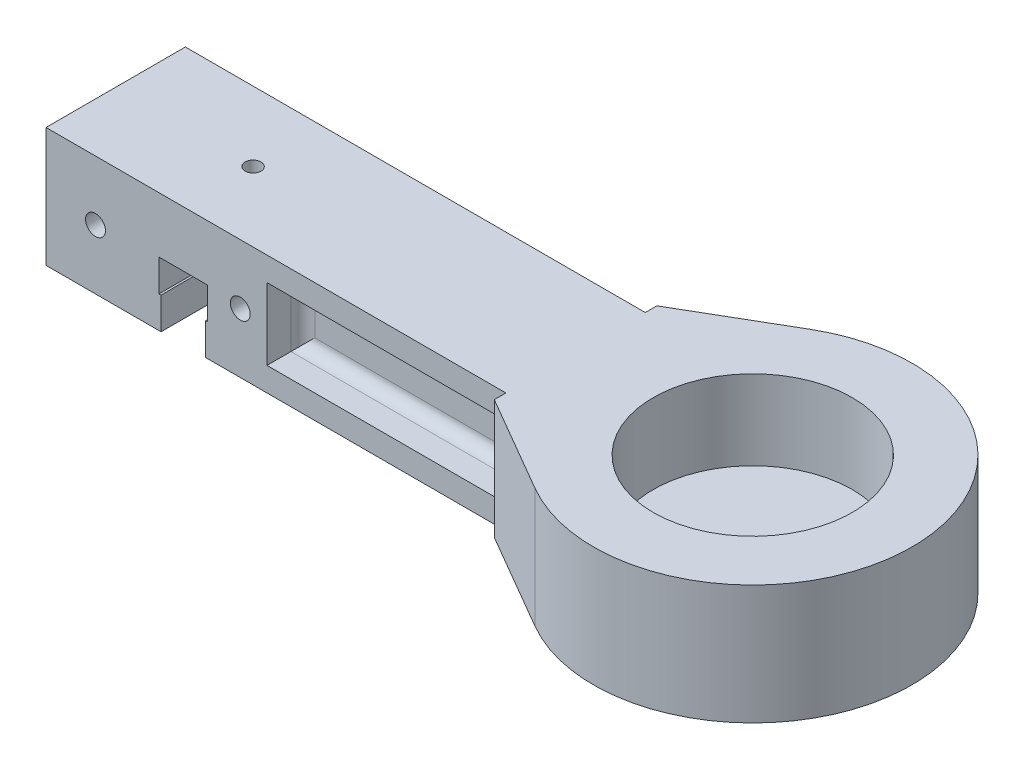
ISO-10303-21;
HEADER;
FILE_DESCRIPTION(('STEP AP214'),'2;1');
FILE_NAME('part.step','',(''),(''),'','','');
FILE_SCHEMA(('AUTOMOTIVE_DESIGN { 1 0 10303 214 1 1 1 1 }'));
ENDSEC;
DATA;
#1=APPLICATION_CONTEXT('core data for automotive mechanical design processes');
#2=APPLICATION_PROTOCOL_DEFINITION('international standard','automotive_design',2000,#1);
#3=PRODUCT_CONTEXT('',#1,'mechanical');
#4=PRODUCT('Part','Part','',(#3));
#5=PRODUCT_RELATED_PRODUCT_CATEGORY('part','',(#4));
#6=PRODUCT_DEFINITION_FORMATION('','',#4);
#7=PRODUCT_DEFINITION_CONTEXT('part definition',#1,'design');
#8=PRODUCT_DEFINITION('design','',#6,#7);
#9=PRODUCT_DEFINITION_SHAPE('','',#8);
#10=(LENGTH_UNIT() NAMED_UNIT(*) SI_UNIT(.MILLI.,.METRE.));
#11=(NAMED_UNIT(*) PLANE_ANGLE_UNIT() SI_UNIT($,.RADIAN.));
#12=(NAMED_UNIT(*) SI_UNIT($,.STERADIAN.) SOLID_ANGLE_UNIT());
#13=UNCERTAINTY_MEASURE_WITH_UNIT(LENGTH_MEASURE(1.E-05),#10,'distance_accuracy_value','');
#14=(GEOMETRIC_REPRESENTATION_CONTEXT(3) GLOBAL_UNCERTAINTY_ASSIGNED_CONTEXT((#13)) GLOBAL_UNIT_ASSIGNED_CONTEXT((#10,
#11,#12)) REPRESENTATION_CONTEXT('',''));
#15=CARTESIAN_POINT('',(0.,0.,0.));
#16=DIRECTION('',(0.,0.,1.));
#17=DIRECTION('',(1.,0.,0.));
#18=AXIS2_PLACEMENT_3D('',#15,#16,#17);
#19=CARTESIAN_POINT('',(-55.4989459475582,91.5559696739877,-40.0100000000001));
#20=DIRECTION('',(-1.,0.,0.));
#21=DIRECTION('',(0.,-1.,0.));
#22=AXIS2_PLACEMENT_3D('',#19,#20,#21);
#23=PLANE('',#22);
#24=DIRECTION('',(0.,1.,0.));
#25=VECTOR('',#24,1.);
#26=CARTESIAN_POINT('',(-55.4989459475582,30.,17.5));
#27=LINE('',#26,#25);
#28=CARTESIAN_POINT('',(-55.4989459475582,0.,17.5));
#29=VERTEX_POINT('',#28);
#30=CARTESIAN_POINT('',(-55.4989459475582,30.,17.5));
#31=VERTEX_POINT('',#30);
#32=EDGE_CURVE('E418',#29,#31,#27,.T.);
#33=ORIENTED_EDGE('',*,*,#32,.T.);
#34=DIRECTION('',(0.,0.,-1.));
#35=VECTOR('',#34,1.);
#36=CARTESIAN_POINT('',(-55.4989459475582,30.,0.));
#37=LINE('',#36,#35);
#38=CARTESIAN_POINT('',(-55.4989459475582,30.,-17.5));
#39=VERTEX_POINT('',#38);
#40=EDGE_CURVE('E305',#31,#39,#37,.T.);
#41=ORIENTED_EDGE('',*,*,#40,.T.);
#42=DIRECTION('',(0.,1.,0.));
#43=VECTOR('',#42,1.);
#44=CARTESIAN_POINT('',(-55.4989459475582,30.,-17.5));
#45=LINE('',#44,#43);
#46=CARTESIAN_POINT('',(-55.4989459475582,0.,-17.5));
#47=VERTEX_POINT('',#46);
#48=EDGE_CURVE('E415',#47,#39,#45,.T.);
#49=ORIENTED_EDGE('',*,*,#48,.F.);
#50=DIRECTION('',(0.,0.,-1.));
#51=VECTOR('',#50,1.);
#52=CARTESIAN_POINT('',(-55.4989459475582,0.,0.));
#53=LINE('',#52,#51);
#54=EDGE_CURVE('E315',#29,#47,#53,.T.);
#55=ORIENTED_EDGE('',*,*,#54,.F.);
#56=EDGE_LOOP('',(#33,#41,#49,#55));
#57=FACE_BOUND('',#56,.T.);
#58=ADVANCED_FACE('F33',(#57),#23,.T.);
#59=CARTESIAN_POINT('',(-21.,8.,-7.04367328411343));
#60=DIRECTION('',(-0.5,0.,-0.866025403784439));
#61=DIRECTION('',(-0.866025403784439,0.,0.5));
#62=AXIS2_PLACEMENT_3D('',#59,#60,#61);
#63=PLANE('',#62);
#64=DIRECTION('',(0.,1.,0.));
#65=VECTOR('',#64,1.);
#66=CARTESIAN_POINT('',(-21.,8.,-7.04367328411343));
#67=LINE('',#66,#65);
#68=CARTESIAN_POINT('',(-21.,8.,-7.04367328411343));
#69=VERTEX_POINT('',#68);
#70=CARTESIAN_POINT('',(-21.,16.,-7.04367328411343));
#71=VERTEX_POINT('',#70);
#72=EDGE_CURVE('E328',#69,#71,#67,.T.);
#73=ORIENTED_EDGE('',*,*,#72,.T.);
#74=DIRECTION('',(-0.866025403784439,0.,0.5));
#75=VECTOR('',#74,1.);
#76=CARTESIAN_POINT('',(-21.,16.,-7.04367328411343));
#77=LINE('',#76,#75);
#78=CARTESIAN_POINT('',(-27.1,16.,-3.52183664205672));
#79=VERTEX_POINT('',#78);
#80=EDGE_CURVE('E346',#71,#79,#77,.T.);
#81=ORIENTED_EDGE('',*,*,#80,.T.);
#82=DIRECTION('',(0.,1.,0.));
#83=VECTOR('',#82,1.);
#84=CARTESIAN_POINT('',(-27.1,8.,-3.52183664205672));
#85=LINE('',#84,#83);
#86=CARTESIAN_POINT('',(-27.1,8.,-3.52183664205672));
#87=VERTEX_POINT('',#86);
#88=EDGE_CURVE('E319',#87,#79,#85,.T.);
#89=ORIENTED_EDGE('',*,*,#88,.F.);
#90=DIRECTION('',(-0.866025403784439,0.,0.5));
#91=VECTOR('',#90,1.);
#92=CARTESIAN_POINT('',(-21.,8.,-7.04367328411343));
#93=LINE('',#92,#91);
#94=EDGE_CURVE('E334',#69,#87,#93,.T.);
#95=ORIENTED_EDGE('',*,*,#94,.F.);
#96=EDGE_LOOP('',(#73,#81,#89,#95));
#97=FACE_BOUND('',#96,.T.);
#98=ADVANCED_FACE('F518',(#97),#63,.F.);
#99=CARTESIAN_POINT('',(-14.9,8.,-3.52183664205671));
#100=DIRECTION('',(0.5,0.,-0.866025403784439));
#101=DIRECTION('',(-0.866025403784439,0.,-0.5));
#102=AXIS2_PLACEMENT_3D('',#99,#100,#101);
#103=PLANE('',#102);
#104=DIRECTION('',(0.,1.,0.));
#105=VECTOR('',#104,1.);
#106=CARTESIAN_POINT('',(-14.9,8.,-3.52183664205671));
#107=LINE('',#106,#105);
#108=CARTESIAN_POINT('',(-14.9,8.,-3.52183664205671));
#109=VERTEX_POINT('',#108);
#110=CARTESIAN_POINT('',(-14.9,16.,-3.52183664205671));
#111=VERTEX_POINT('',#110);
#112=EDGE_CURVE('E324',#109,#111,#107,.T.);
#113=ORIENTED_EDGE('',*,*,#112,.T.);
#114=DIRECTION('',(-0.866025403784439,0.,-0.5));
#115=VECTOR('',#114,1.);
#116=CARTESIAN_POINT('',(-14.9,16.,-3.52183664205671));
#117=LINE('',#116,#115);
#118=EDGE_CURVE('E311',#111,#71,#117,.T.);
#119=ORIENTED_EDGE('',*,*,#118,.T.);
#120=ORIENTED_EDGE('',*,*,#72,.F.);
#121=DIRECTION('',(-0.866025403784439,0.,-0.5));
#122=VECTOR('',#121,1.);
#123=CARTESIAN_POINT('',(-14.9,8.,-3.52183664205671));
#124=LINE('',#123,#122);
#125=EDGE_CURVE('E337',#109,#69,#124,.T.);
#126=ORIENTED_EDGE('',*,*,#125,.F.);
#127=EDGE_LOOP('',(#113,#119,#120,#126));
#128=FACE_BOUND('',#127,.T.);
#129=ADVANCED_FACE('F520',(#128),#103,.F.);
#130=CARTESIAN_POINT('',(104.501054052442,10.,0.));
#131=DIRECTION('',(0.,1.,0.));
#132=DIRECTION('',(0.,0.,1.));
#133=AXIS2_PLACEMENT_3D('',#130,#131,#132);
#134=PLANE('',#133);
#135=CARTESIAN_POINT('',(104.501054052442,10.,0.));
#136=DIRECTION('',(0.,1.,0.));
#137=DIRECTION('',(0.,0.,1.));
#138=AXIS2_PLACEMENT_3D('',#135,#136,#137);
#139=CIRCLE('',#138,25.);
#140=CARTESIAN_POINT('',(104.501054052442,10.,25.));
#141=VERTEX_POINT('',#140);
#142=EDGE_CURVE('E401',#141,#141,#139,.T.);
#143=ORIENTED_EDGE('',*,*,#142,.T.);
#144=EDGE_LOOP('',(#143));
#145=FACE_BOUND('',#144,.T.);
#146=ADVANCED_FACE('F527',(#145),#134,.T.);
#147=CARTESIAN_POINT('',(-14.9,8.,3.52183664205672));
#148=DIRECTION('',(1.,0.,0.));
#149=DIRECTION('',(0.,0.,-1.));
#150=AXIS2_PLACEMENT_3D('',#147,#148,#149);
#151=PLANE('',#150);
#152=DIRECTION('',(0.,0.,-1.));
#153=VECTOR('',#152,1.);
#154=CARTESIAN_POINT('',(-14.9,16.,3.52183664205672));
#155=LINE('',#154,#153);
#156=CARTESIAN_POINT('',(-14.9,16.,17.5));
#157=VERTEX_POINT('',#156);
#158=EDGE_CURVE('E342',#157,#111,#155,.T.);
#159=ORIENTED_EDGE('',*,*,#158,.T.);
#160=ORIENTED_EDGE('',*,*,#112,.F.);
#161=DIRECTION('',(0.,0.,-1.));
#162=VECTOR('',#161,1.);
#163=CARTESIAN_POINT('',(-14.9,8.,3.52183664205672));
#164=LINE('',#163,#162);
#165=CARTESIAN_POINT('',(-14.9,8.,17.5));
#166=VERTEX_POINT('',#165);
#167=EDGE_CURVE('E340',#166,#109,#164,.T.);
#168=ORIENTED_EDGE('',*,*,#167,.F.);
#169=DIRECTION('',(0.,1.,0.));
#170=VECTOR('',#169,1.);
#171=CARTESIAN_POINT('',(-14.9,8.,17.5));
#172=LINE('',#171,#170);
#173=EDGE_CURVE('E362',#166,#157,#172,.T.);
#174=ORIENTED_EDGE('',*,*,#173,.T.);
#175=EDGE_LOOP('',(#159,#160,#168,#174));
#176=FACE_BOUND('',#175,.T.);
#177=ADVANCED_FACE('F548',(#176),#151,.F.);
#178=CARTESIAN_POINT('',(-38.,16.,11.0434775432545));
#179=DIRECTION('',(0.,-1.,0.));
#180=DIRECTION('',(0.,0.,-1.));
#181=AXIS2_PLACEMENT_3D('',#178,#179,#180);
#182=PLANE('',#181);
#183=CARTESIAN_POINT('',(-21.,16.,0.));
#184=DIRECTION('',(0.,-1.,0.));
#185=DIRECTION('',(0.,0.,-1.));
#186=AXIS2_PLACEMENT_3D('',#183,#184,#185);
#187=CIRCLE('',#186,2.);
#188=CARTESIAN_POINT('',(-21.,16.,-2.));
#189=VERTEX_POINT('',#188);
#190=EDGE_CURVE('E306',#189,#189,#187,.T.);
#191=ORIENTED_EDGE('',*,*,#190,.F.);
#192=EDGE_LOOP('',(#191));
#193=FACE_BOUND('',#192,.T.);
#194=ORIENTED_EDGE('',*,*,#158,.F.);
#195=DIRECTION('',(-1.,0.,0.));
#196=VECTOR('',#195,1.);
#197=CARTESIAN_POINT('',(-21.,16.,17.5));
#198=LINE('',#197,#196);
#199=CARTESIAN_POINT('',(-27.1,16.,17.5));
#200=VERTEX_POINT('',#199);
#201=EDGE_CURVE('E359',#157,#200,#198,.T.);
#202=ORIENTED_EDGE('',*,*,#201,.T.);
#203=DIRECTION('',(0.,0.,1.));
#204=VECTOR('',#203,1.);
#205=CARTESIAN_POINT('',(-27.1,16.,-3.52183664205672));
#206=LINE('',#205,#204);
#207=EDGE_CURVE('E344',#79,#200,#206,.T.);
#208=ORIENTED_EDGE('',*,*,#207,.F.);
#209=ORIENTED_EDGE('',*,*,#80,.F.);
#210=ORIENTED_EDGE('',*,*,#118,.F.);
#211=EDGE_LOOP('',(#194,#202,#208,#209,#210));
#212=FACE_BOUND('',#211,.T.);
#213=ADVANCED_FACE('F540',(#193,#212),#182,.T.);
#214=CARTESIAN_POINT('',(-27.1,8.,-3.52183664205672));
#215=DIRECTION('',(-1.,0.,0.));
#216=DIRECTION('',(0.,0.,1.));
#217=AXIS2_PLACEMENT_3D('',#214,#215,#216);
#218=PLANE('',#217);
#219=DIRECTION('',(0.,-1.,0.));
#220=VECTOR('',#219,1.);
#221=CARTESIAN_POINT('',(-27.1,8.,17.5));
#222=LINE('',#221,#220);
#223=CARTESIAN_POINT('',(-27.1,8.,17.5));
#224=VERTEX_POINT('',#223);
#225=EDGE_CURVE('E310',#200,#224,#222,.T.);
#226=ORIENTED_EDGE('',*,*,#225,.T.);
#227=DIRECTION('',(0.,0.,1.));
#228=VECTOR('',#227,1.);
#229=CARTESIAN_POINT('',(-27.1,8.,-3.52183664205672));
#230=LINE('',#229,#228);
#231=EDGE_CURVE('E327',#87,#224,#230,.T.);
#232=ORIENTED_EDGE('',*,*,#231,.F.);
#233=ORIENTED_EDGE('',*,*,#88,.T.);
#234=ORIENTED_EDGE('',*,*,#207,.T.);
#235=EDGE_LOOP('',(#226,#232,#233,#234));
#236=FACE_BOUND('',#235,.T.);
#237=ADVANCED_FACE('F536',(#236),#218,.F.);
#238=CARTESIAN_POINT('',(0.,8.,0.));
#239=DIRECTION('',(0.,1.,0.));
#240=DIRECTION('',(0.,0.,1.));
#241=AXIS2_PLACEMENT_3D('',#238,#239,#240);
#242=PLANE('',#241);
#243=DIRECTION('',(0.,0.,1.));
#244=VECTOR('',#243,1.);
#245=CARTESIAN_POINT('',(-15.4,8.,0.));
#246=LINE('',#245,#244);
#247=CARTESIAN_POINT('',(-15.4,8.,0.));
#248=VERTEX_POINT('',#247);
#249=CARTESIAN_POINT('',(-15.4,8.,17.5));
#250=VERTEX_POINT('',#249);
#251=EDGE_CURVE('E349',#248,#250,#246,.T.);
#252=ORIENTED_EDGE('',*,*,#251,.T.);
#253=DIRECTION('',(1.,0.,0.));
#254=VECTOR('',#253,1.);
#255=CARTESIAN_POINT('',(-15.4,8.,17.5));
#256=LINE('',#255,#254);
#257=EDGE_CURVE('E366',#250,#166,#256,.T.);
#258=ORIENTED_EDGE('',*,*,#257,.T.);
#259=ORIENTED_EDGE('',*,*,#167,.T.);
#260=ORIENTED_EDGE('',*,*,#125,.T.);
#261=ORIENTED_EDGE('',*,*,#94,.T.);
#262=ORIENTED_EDGE('',*,*,#231,.T.);
#263=DIRECTION('',(1.,0.,0.));
#264=VECTOR('',#263,1.);
#265=CARTESIAN_POINT('',(-27.1,8.,17.5));
#266=LINE('',#265,#264);
#267=CARTESIAN_POINT('',(-26.6,8.,17.5));
#268=VERTEX_POINT('',#267);
#269=EDGE_CURVE('E375',#224,#268,#266,.T.);
#270=ORIENTED_EDGE('',*,*,#269,.T.);
#271=DIRECTION('',(0.,0.,1.));
#272=VECTOR('',#271,1.);
#273=CARTESIAN_POINT('',(-26.6,8.,0.));
#274=LINE('',#273,#272);
#275=CARTESIAN_POINT('',(-26.6,8.,0.));
#276=VERTEX_POINT('',#275);
#277=EDGE_CURVE('E350',#276,#268,#274,.T.);
#278=ORIENTED_EDGE('',*,*,#277,.F.);
#279=CARTESIAN_POINT('',(-21.,8.,0.));
#280=DIRECTION('',(0.,1.,0.));
#281=DIRECTION('',(0.,0.,1.));
#282=AXIS2_PLACEMENT_3D('',#279,#280,#281);
#283=CIRCLE('',#282,5.6);
#284=EDGE_CURVE('E316',#276,#248,#283,.F.);
#285=ORIENTED_EDGE('',*,*,#284,.T.);
#286=EDGE_LOOP('',(#252,#258,#259,#260,#261,#262,#270,#278,#285));
#287=FACE_BOUND('',#286,.T.);
#288=ADVANCED_FACE('F539',(#287),#242,.T.);
#289=CARTESIAN_POINT('',(-26.6,8.,0.));
#290=DIRECTION('',(-1.,0.,0.));
#291=DIRECTION('',(0.,0.,1.));
#292=AXIS2_PLACEMENT_3D('',#289,#290,#291);
#293=PLANE('',#292);
#294=DIRECTION('',(0.,-1.,0.));
#295=VECTOR('',#294,1.);
#296=CARTESIAN_POINT('',(-26.6,8.,17.5));
#297=LINE('',#296,#295);
#298=CARTESIAN_POINT('',(-26.6,0.,17.5));
#299=VERTEX_POINT('',#298);
#300=EDGE_CURVE('E372',#268,#299,#297,.T.);
#301=ORIENTED_EDGE('',*,*,#300,.T.);
#302=DIRECTION('',(0.,0.,1.));
#303=VECTOR('',#302,1.);
#304=CARTESIAN_POINT('',(-26.6,0.,0.));
#305=LINE('',#304,#303);
#306=CARTESIAN_POINT('',(-26.6,0.,0.));
#307=VERTEX_POINT('',#306);
#308=EDGE_CURVE('E353',#307,#299,#305,.T.);
#309=ORIENTED_EDGE('',*,*,#308,.F.);
#310=DIRECTION('',(0.,-1.,0.));
#311=VECTOR('',#310,1.);
#312=CARTESIAN_POINT('',(-26.6,8.,0.));
#313=LINE('',#312,#311);
#314=EDGE_CURVE('E363',#276,#307,#313,.T.);
#315=ORIENTED_EDGE('',*,*,#314,.F.);
#316=ORIENTED_EDGE('',*,*,#277,.T.);
#317=EDGE_LOOP('',(#301,#309,#315,#316));
#318=FACE_BOUND('',#317,.T.);
#319=ADVANCED_FACE('F544',(#318),#293,.F.);
#320=CARTESIAN_POINT('',(-21.,30.,0.));
#321=DIRECTION('',(0.,-1.,0.));
#322=DIRECTION('',(0.,0.,-1.));
#323=AXIS2_PLACEMENT_3D('',#320,#321,#322);
#324=CYLINDRICAL_SURFACE('',#323,5.6);
#325=ORIENTED_EDGE('',*,*,#314,.T.);
#326=CARTESIAN_POINT('',(-21.,0.,0.));
#327=DIRECTION('',(0.,-1.,0.));
#328=DIRECTION('',(0.,0.,-1.));
#329=AXIS2_PLACEMENT_3D('',#326,#327,#328);
#330=CIRCLE('',#329,5.6);
#331=CARTESIAN_POINT('',(-15.4,0.,0.));
#332=VERTEX_POINT('',#331);
#333=EDGE_CURVE('E320',#307,#332,#330,.T.);
#334=ORIENTED_EDGE('',*,*,#333,.T.);
#335=DIRECTION('',(0.,1.,0.));
#336=VECTOR('',#335,1.);
#337=CARTESIAN_POINT('',(-15.4,0.,0.));
#338=LINE('',#337,#336);
#339=EDGE_CURVE('E352',#332,#248,#338,.T.);
#340=ORIENTED_EDGE('',*,*,#339,.T.);
#341=ORIENTED_EDGE('',*,*,#284,.F.);
#342=EDGE_LOOP('',(#325,#334,#340,#341));
#343=FACE_BOUND('',#342,.T.);
#344=ADVANCED_FACE('F552',(#343),#324,.F.);
#345=CARTESIAN_POINT('',(-15.4,0.,0.));
#346=DIRECTION('',(1.,0.,0.));
#347=DIRECTION('',(0.,0.,-1.));
#348=AXIS2_PLACEMENT_3D('',#345,#346,#347);
#349=PLANE('',#348);
#350=DIRECTION('',(0.,1.,0.));
#351=VECTOR('',#350,1.);
#352=CARTESIAN_POINT('',(-15.4,0.,17.5));
#353=LINE('',#352,#351);
#354=CARTESIAN_POINT('',(-15.4,0.,17.5));
#355=VERTEX_POINT('',#354);
#356=EDGE_CURVE('E369',#355,#250,#353,.T.);
#357=ORIENTED_EDGE('',*,*,#356,.T.);
#358=ORIENTED_EDGE('',*,*,#251,.F.);
#359=ORIENTED_EDGE('',*,*,#339,.F.);
#360=DIRECTION('',(0.,0.,1.));
#361=VECTOR('',#360,1.);
#362=CARTESIAN_POINT('',(-15.4,0.,0.));
#363=LINE('',#362,#361);
#364=EDGE_CURVE('E356',#332,#355,#363,.T.);
#365=ORIENTED_EDGE('',*,*,#364,.T.);
#366=EDGE_LOOP('',(#357,#358,#359,#365));
#367=FACE_BOUND('',#366,.T.);
#368=ADVANCED_FACE('F554',(#367),#349,.F.);
#369=CARTESIAN_POINT('',(55.,0.,17.4999999999999));
#370=DIRECTION('',(-0.50238861787355,0.,0.864641935503422));
#371=DIRECTION('',(0.864641935503422,0.,0.50238861787355));
#372=AXIS2_PLACEMENT_3D('',#369,#370,#371);
#373=PLANE('',#372);
#374=DIRECTION('',(0.,1.,0.));
#375=VECTOR('',#374,1.);
#376=CARTESIAN_POINT('',(60.,0.,20.4051830430884));
#377=LINE('',#376,#375);
#378=CARTESIAN_POINT('',(60.,0.,20.4051830430884));
#379=VERTEX_POINT('',#378);
#380=CARTESIAN_POINT('',(60.,30.,20.4051830430884));
#381=VERTEX_POINT('',#380);
#382=EDGE_CURVE('E290',#379,#381,#377,.T.);
#383=ORIENTED_EDGE('',*,*,#382,.F.);
#384=DIRECTION('',(0.864641935503422,0.,0.50238861787355));
#385=VECTOR('',#384,1.);
#386=CARTESIAN_POINT('',(55.,0.,17.4999999999999));
#387=LINE('',#386,#385);
#388=CARTESIAN_POINT('',(84.4055093374998,0.,34.5856774201368));
#389=VERTEX_POINT('',#388);
#390=EDGE_CURVE('E404',#379,#389,#387,.T.);
#391=ORIENTED_EDGE('',*,*,#390,.T.);
#392=DIRECTION('',(0.,1.,0.));
#393=VECTOR('',#392,1.);
#394=CARTESIAN_POINT('',(84.4055093374998,0.,34.5856774201368));
#395=LINE('',#394,#393);
#396=CARTESIAN_POINT('',(84.4055093374998,30.,34.5856774201368));
#397=VERTEX_POINT('',#396);
#398=EDGE_CURVE('E387',#389,#397,#395,.T.);
#399=ORIENTED_EDGE('',*,*,#398,.T.);
#400=DIRECTION('',(0.864641935503422,0.,0.50238861787355));
#401=VECTOR('',#400,1.);
#402=CARTESIAN_POINT('',(55.,30.,17.4999999999999));
#403=LINE('',#402,#401);
#404=EDGE_CURVE('E395',#381,#397,#403,.T.);
#405=ORIENTED_EDGE('',*,*,#404,.F.);
#406=EDGE_LOOP('',(#383,#391,#399,#405));
#407=FACE_BOUND('',#406,.T.);
#408=ADVANCED_FACE('F557',(#407),#373,.T.);
#409=CARTESIAN_POINT('',(104.501054052442,0.,0.));
#410=DIRECTION('',(0.,1.,0.));
#411=DIRECTION('',(0.,0.,1.));
#412=AXIS2_PLACEMENT_3D('',#409,#410,#411);
#413=CYLINDRICAL_SURFACE('',#412,40.);
#414=CARTESIAN_POINT('',(104.501054052442,30.,0.));
#415=DIRECTION('',(0.,1.,0.));
#416=DIRECTION('',(0.,0.,1.));
#417=AXIS2_PLACEMENT_3D('',#414,#415,#416);
#418=CIRCLE('',#417,40.);
#419=CARTESIAN_POINT('',(84.4055093374998,30.,-34.5856774201369));
#420=VERTEX_POINT('',#419);
#421=EDGE_CURVE('E392',#397,#420,#418,.T.);
#422=ORIENTED_EDGE('',*,*,#421,.F.);
#423=ORIENTED_EDGE('',*,*,#398,.F.);
#424=CARTESIAN_POINT('',(104.501054052442,0.,0.));
#425=DIRECTION('',(0.,1.,0.));
#426=DIRECTION('',(0.,0.,1.));
#427=AXIS2_PLACEMENT_3D('',#424,#425,#426);
#428=CIRCLE('',#427,40.);
#429=CARTESIAN_POINT('',(84.4055093374998,0.,-34.5856774201369));
#430=VERTEX_POINT('',#429);
#431=EDGE_CURVE('E390',#389,#430,#428,.T.);
#432=ORIENTED_EDGE('',*,*,#431,.T.);
#433=DIRECTION('',(0.,1.,0.));
#434=VECTOR('',#433,1.);
#435=CARTESIAN_POINT('',(84.4055093374998,0.,-34.5856774201369));
#436=LINE('',#435,#434);
#437=EDGE_CURVE('E386',#430,#420,#436,.T.);
#438=ORIENTED_EDGE('',*,*,#437,.T.);
#439=EDGE_LOOP('',(#422,#423,#432,#438));
#440=FACE_BOUND('',#439,.T.);
#441=ADVANCED_FACE('F568',(#440),#413,.T.);
#442=CARTESIAN_POINT('',(84.4055093374998,0.,-34.5856774201369));
#443=DIRECTION('',(-0.502388617873549,0.,-0.864641935503422));
#444=DIRECTION('',(-0.864641935503423,0.,0.502388617873549));
#445=AXIS2_PLACEMENT_3D('',#442,#443,#444);
#446=PLANE('',#445);
#447=DIRECTION('',(0.,-1.,0.));
#448=VECTOR('',#447,1.);
#449=CARTESIAN_POINT('',(60.,0.,-20.4051830430885));
#450=LINE('',#449,#448);
#451=CARTESIAN_POINT('',(60.,30.,-20.4051830430885));
#452=VERTEX_POINT('',#451);
#453=CARTESIAN_POINT('',(60.,0.,-20.4051830430885));
#454=VERTEX_POINT('',#453);
#455=EDGE_CURVE('E294',#452,#454,#450,.T.);
#456=ORIENTED_EDGE('',*,*,#455,.F.);
#457=DIRECTION('',(-0.864641935503423,0.,0.502388617873549));
#458=VECTOR('',#457,1.);
#459=CARTESIAN_POINT('',(84.4055093374998,30.,-34.5856774201369));
#460=LINE('',#459,#458);
#461=EDGE_CURVE('E398',#420,#452,#460,.T.);
#462=ORIENTED_EDGE('',*,*,#461,.F.);
#463=ORIENTED_EDGE('',*,*,#437,.F.);
#464=DIRECTION('',(-0.864641935503423,0.,0.502388617873549));
#465=VECTOR('',#464,1.);
#466=CARTESIAN_POINT('',(84.4055093374998,0.,-34.5856774201369));
#467=LINE('',#466,#465);
#468=EDGE_CURVE('E396',#430,#454,#467,.T.);
#469=ORIENTED_EDGE('',*,*,#468,.T.);
#470=EDGE_LOOP('',(#456,#462,#463,#469));
#471=FACE_BOUND('',#470,.T.);
#472=ADVANCED_FACE('F564',(#471),#446,.T.);
#473=CARTESIAN_POINT('',(-247.,30.,-17.5));
#474=DIRECTION('',(0.,0.,-1.));
#475=DIRECTION('',(-1.,0.,0.));
#476=AXIS2_PLACEMENT_3D('',#473,#474,#475);
#477=PLANE('',#476);
#478=DIRECTION('',(0.,1.,0.));
#479=VECTOR('',#478,1.);
#480=CARTESIAN_POINT('',(60.,0.,-17.5));
#481=LINE('',#480,#479);
#482=CARTESIAN_POINT('',(60.,0.,-17.5));
#483=VERTEX_POINT('',#482);
#484=CARTESIAN_POINT('',(60.,6.,-17.5));
#485=VERTEX_POINT('',#484);
#486=EDGE_CURVE('E254',#483,#485,#481,.T.);
#487=ORIENTED_EDGE('',*,*,#486,.F.);
#488=DIRECTION('',(1.,0.,0.));
#489=VECTOR('',#488,1.);
#490=CARTESIAN_POINT('',(-247.,0.,-17.5));
#491=LINE('',#490,#489);
#492=EDGE_CURVE('E323',#47,#483,#491,.T.);
#493=ORIENTED_EDGE('',*,*,#492,.F.);
#494=ORIENTED_EDGE('',*,*,#48,.T.);
#495=DIRECTION('',(1.,0.,0.));
#496=VECTOR('',#495,1.);
#497=CARTESIAN_POINT('',(-247.,30.,-17.5));
#498=LINE('',#497,#496);
#499=CARTESIAN_POINT('',(60.,30.,-17.5));
#500=VERTEX_POINT('',#499);
#501=EDGE_CURVE('E424',#39,#500,#498,.T.);
#502=ORIENTED_EDGE('',*,*,#501,.T.);
#503=DIRECTION('',(0.,1.,0.));
#504=VECTOR('',#503,1.);
#505=CARTESIAN_POINT('',(60.,24.,-17.5));
#506=LINE('',#505,#504);
#507=CARTESIAN_POINT('',(60.,24.,-17.5));
#508=VERTEX_POINT('',#507);
#509=EDGE_CURVE('E264',#508,#500,#506,.T.);
#510=ORIENTED_EDGE('',*,*,#509,.F.);
#511=DIRECTION('',(-1.,0.,0.));
#512=VECTOR('',#511,1.);
#513=CARTESIAN_POINT('',(60.,24.,-17.5));
#514=LINE('',#513,#512);
#515=CARTESIAN_POINT('',(0.,24.,-17.5));
#516=VERTEX_POINT('',#515);
#517=EDGE_CURVE('E282',#508,#516,#514,.T.);
#518=ORIENTED_EDGE('',*,*,#517,.T.);
#519=DIRECTION('',(0.,-1.,0.));
#520=VECTOR('',#519,1.);
#521=CARTESIAN_POINT('',(0.,30.,-17.5));
#522=LINE('',#521,#520);
#523=CARTESIAN_POINT('',(0.,6.,-17.5));
#524=VERTEX_POINT('',#523);
#525=EDGE_CURVE('E287',#516,#524,#522,.T.);
#526=ORIENTED_EDGE('',*,*,#525,.T.);
#527=DIRECTION('',(-1.,0.,0.));
#528=VECTOR('',#527,1.);
#529=CARTESIAN_POINT('',(60.,6.,-17.5));
#530=LINE('',#529,#528);
#531=EDGE_CURVE('E247',#485,#524,#530,.T.);
#532=ORIENTED_EDGE('',*,*,#531,.F.);
#533=EDGE_LOOP('',(#487,#493,#494,#502,#510,#518,#526,#532));
#534=FACE_BOUND('',#533,.T.);
#535=CARTESIAN_POINT('',(-43.0740192619808,15.,-17.5));
#536=DIRECTION('',(0.,0.,-1.));
#537=DIRECTION('',(-1.,0.,0.));
#538=AXIS2_PLACEMENT_3D('',#535,#536,#537);
#539=CIRCLE('',#538,2.5);
#540=CARTESIAN_POINT('',(-45.5740192619808,15.,-17.5));
#541=VERTEX_POINT('',#540);
#542=EDGE_CURVE('E302',#541,#541,#539,.T.);
#543=ORIENTED_EDGE('',*,*,#542,.F.);
#544=EDGE_LOOP('',(#543));
#545=FACE_BOUND('',#544,.T.);
#546=CARTESIAN_POINT('',(-6.70657386989238,15.,-17.5));
#547=DIRECTION('',(0.,0.,-1.));
#548=DIRECTION('',(-1.,0.,0.));
#549=AXIS2_PLACEMENT_3D('',#546,#547,#548);
#550=CIRCLE('',#549,2.5);
#551=CARTESIAN_POINT('',(-9.20657386989238,15.,-17.5));
#552=VERTEX_POINT('',#551);
#553=EDGE_CURVE('E297',#552,#552,#550,.T.);
#554=ORIENTED_EDGE('',*,*,#553,.F.);
#555=EDGE_LOOP('',(#554));
#556=FACE_BOUND('',#555,.T.);
#557=ADVANCED_FACE('F567',(#534,#545,#556),#477,.T.);
#558=CARTESIAN_POINT('',(-247.,30.,17.5));
#559=DIRECTION('',(0.,0.,-1.));
#560=DIRECTION('',(-1.,0.,0.));
#561=AXIS2_PLACEMENT_3D('',#558,#559,#560);
#562=PLANE('',#561);
#563=DIRECTION('',(-1.,0.,0.));
#564=VECTOR('',#563,1.);
#565=CARTESIAN_POINT('',(60.,6.,17.5));
#566=LINE('',#565,#564);
#567=CARTESIAN_POINT('',(60.,6.,17.5));
#568=VERTEX_POINT('',#567);
#569=CARTESIAN_POINT('',(0.,6.,17.5));
#570=VERTEX_POINT('',#569);
#571=EDGE_CURVE('E239',#568,#570,#566,.T.);
#572=ORIENTED_EDGE('',*,*,#571,.T.);
#573=DIRECTION('',(0.,-1.,0.));
#574=VECTOR('',#573,1.);
#575=CARTESIAN_POINT('',(0.,30.,17.5));
#576=LINE('',#575,#574);
#577=CARTESIAN_POINT('',(0.,24.,17.5));
#578=VERTEX_POINT('',#577);
#579=EDGE_CURVE('E246',#578,#570,#576,.T.);
#580=ORIENTED_EDGE('',*,*,#579,.F.);
#581=DIRECTION('',(-1.,0.,0.));
#582=VECTOR('',#581,1.);
#583=CARTESIAN_POINT('',(60.,24.,17.5));
#584=LINE('',#583,#582);
#585=CARTESIAN_POINT('',(60.,24.,17.5));
#586=VERTEX_POINT('',#585);
#587=EDGE_CURVE('E270',#586,#578,#584,.T.);
#588=ORIENTED_EDGE('',*,*,#587,.F.);
#589=DIRECTION('',(0.,-1.,0.));
#590=VECTOR('',#589,1.);
#591=CARTESIAN_POINT('',(60.,30.,17.5));
#592=LINE('',#591,#590);
#593=CARTESIAN_POINT('',(60.,30.,17.5));
#594=VERTEX_POINT('',#593);
#595=EDGE_CURVE('E267',#594,#586,#592,.T.);
#596=ORIENTED_EDGE('',*,*,#595,.F.);
#597=DIRECTION('',(1.,0.,0.));
#598=VECTOR('',#597,1.);
#599=CARTESIAN_POINT('',(-247.,30.,17.5));
#600=LINE('',#599,#598);
#601=EDGE_CURVE('E314',#31,#594,#600,.T.);
#602=ORIENTED_EDGE('',*,*,#601,.F.);
#603=ORIENTED_EDGE('',*,*,#32,.F.);
#604=DIRECTION('',(1.,0.,0.));
#605=VECTOR('',#604,1.);
#606=CARTESIAN_POINT('',(-247.,0.,17.5));
#607=LINE('',#606,#605);
#608=EDGE_CURVE('E426',#29,#299,#607,.T.);
#609=ORIENTED_EDGE('',*,*,#608,.T.);
#610=ORIENTED_EDGE('',*,*,#300,.F.);
#611=ORIENTED_EDGE('',*,*,#269,.F.);
#612=ORIENTED_EDGE('',*,*,#225,.F.);
#613=ORIENTED_EDGE('',*,*,#201,.F.);
#614=ORIENTED_EDGE('',*,*,#173,.F.);
#615=ORIENTED_EDGE('',*,*,#257,.F.);
#616=ORIENTED_EDGE('',*,*,#356,.F.);
#617=CARTESIAN_POINT('',(60.,0.,17.5));
#618=VERTEX_POINT('',#617);
#619=EDGE_CURVE('E253',#355,#618,#607,.T.);
#620=ORIENTED_EDGE('',*,*,#619,.T.);
#621=DIRECTION('',(0.,-1.,0.));
#622=VECTOR('',#621,1.);
#623=CARTESIAN_POINT('',(60.,6.,17.5));
#624=LINE('',#623,#622);
#625=EDGE_CURVE('E230',#568,#618,#624,.T.);
#626=ORIENTED_EDGE('',*,*,#625,.F.);
#627=EDGE_LOOP('',(#572,#580,#588,#596,#602,#603,#609,#610,#611,#612,#613,#614,#615,#616,#620,#626));
#628=FACE_BOUND('',#627,.T.);
#629=CARTESIAN_POINT('',(-6.70657386989237,15.,17.5));
#630=DIRECTION('',(0.,0.,-1.));
#631=DIRECTION('',(-1.,0.,0.));
#632=AXIS2_PLACEMENT_3D('',#629,#630,#631);
#633=CIRCLE('',#632,2.5);
#634=CARTESIAN_POINT('',(-9.20657386989237,15.,17.5));
#635=VERTEX_POINT('',#634);
#636=EDGE_CURVE('E301',#635,#635,#633,.T.);
#637=ORIENTED_EDGE('',*,*,#636,.T.);
#638=EDGE_LOOP('',(#637));
#639=FACE_BOUND('',#638,.T.);
#640=CARTESIAN_POINT('',(-43.0740192619808,15.,17.5));
#641=DIRECTION('',(0.,0.,-1.));
#642=DIRECTION('',(-1.,0.,0.));
#643=AXIS2_PLACEMENT_3D('',#640,#641,#642);
#644=CIRCLE('',#643,2.5);
#645=CARTESIAN_POINT('',(-45.5740192619808,15.,17.5));
#646=VERTEX_POINT('',#645);
#647=EDGE_CURVE('E300',#646,#646,#644,.T.);
#648=ORIENTED_EDGE('',*,*,#647,.T.);
#649=EDGE_LOOP('',(#648));
#650=FACE_BOUND('',#649,.T.);
#651=ADVANCED_FACE('F249',(#628,#639,#650),#562,.F.);
#652=CARTESIAN_POINT('',(0.,0.,0.));
#653=DIRECTION('',(0.,-1.,0.));
#654=DIRECTION('',(0.,0.,-1.));
#655=AXIS2_PLACEMENT_3D('',#652,#653,#654);
#656=PLANE('',#655);
#657=DIRECTION('',(0.,0.,1.));
#658=VECTOR('',#657,1.);
#659=CARTESIAN_POINT('',(60.,0.,0.));
#660=LINE('',#659,#658);
#661=EDGE_CURVE('E292',#618,#379,#660,.T.);
#662=ORIENTED_EDGE('',*,*,#661,.F.);
#663=ORIENTED_EDGE('',*,*,#619,.F.);
#664=ORIENTED_EDGE('',*,*,#364,.F.);
#665=ORIENTED_EDGE('',*,*,#333,.F.);
#666=ORIENTED_EDGE('',*,*,#308,.T.);
#667=ORIENTED_EDGE('',*,*,#608,.F.);
#668=ORIENTED_EDGE('',*,*,#54,.T.);
#669=ORIENTED_EDGE('',*,*,#492,.T.);
#670=EDGE_CURVE('E295',#454,#483,#660,.T.);
#671=ORIENTED_EDGE('',*,*,#670,.F.);
#672=ORIENTED_EDGE('',*,*,#468,.F.);
#673=ORIENTED_EDGE('',*,*,#431,.F.);
#674=ORIENTED_EDGE('',*,*,#390,.F.);
#675=EDGE_LOOP('',(#662,#663,#664,#665,#666,#667,#668,#669,#671,#672,#673,#674));
#676=FACE_BOUND('',#675,.T.);
#677=ADVANCED_FACE('F578',(#676),#656,.T.);
#678=CARTESIAN_POINT('',(104.501054052442,10.,0.));
#679=DIRECTION('',(0.,1.,0.));
#680=DIRECTION('',(0.,0.,1.));
#681=AXIS2_PLACEMENT_3D('',#678,#679,#680);
#682=CYLINDRICAL_SURFACE('',#681,25.);
#683=ORIENTED_EDGE('',*,*,#142,.F.);
#684=EDGE_LOOP('',(#683));
#685=FACE_BOUND('',#684,.T.);
#686=CARTESIAN_POINT('',(104.501054052442,30.,0.));
#687=DIRECTION('',(0.,1.,0.));
#688=DIRECTION('',(0.,0.,1.));
#689=AXIS2_PLACEMENT_3D('',#686,#687,#688);
#690=CIRCLE('',#689,25.);
#691=CARTESIAN_POINT('',(104.501054052442,30.,25.));
#692=VERTEX_POINT('',#691);
#693=EDGE_CURVE('E408',#692,#692,#690,.T.);
#694=ORIENTED_EDGE('',*,*,#693,.T.);
#695=EDGE_LOOP('',(#694));
#696=FACE_BOUND('',#695,.T.);
#697=ADVANCED_FACE('F562',(#685,#696),#682,.F.);
#698=CARTESIAN_POINT('',(-21.,-8.,0.));
#699=DIRECTION('',(0.,1.,0.));
#700=DIRECTION('',(0.,0.,1.));
#701=AXIS2_PLACEMENT_3D('',#698,#699,#700);
#702=CYLINDRICAL_SURFACE('',#701,2.);
#703=ORIENTED_EDGE('',*,*,#190,.T.);
#704=EDGE_LOOP('',(#703));
#705=FACE_BOUND('',#704,.T.);
#706=CARTESIAN_POINT('',(-21.,30.,0.));
#707=DIRECTION('',(0.,1.,0.));
#708=DIRECTION('',(0.,0.,1.));
#709=AXIS2_PLACEMENT_3D('',#706,#707,#708);
#710=CIRCLE('',#709,2.);
#711=CARTESIAN_POINT('',(-21.,30.,2.));
#712=VERTEX_POINT('',#711);
#713=EDGE_CURVE('E309',#712,#712,#710,.T.);
#714=ORIENTED_EDGE('',*,*,#713,.T.);
#715=EDGE_LOOP('',(#714));
#716=FACE_BOUND('',#715,.T.);
#717=ADVANCED_FACE('F559',(#705,#716),#702,.F.);
#718=CARTESIAN_POINT('',(0.,30.,0.));
#719=DIRECTION('',(0.,-1.,0.));
#720=DIRECTION('',(0.,0.,-1.));
#721=AXIS2_PLACEMENT_3D('',#718,#719,#720);
#722=PLANE('',#721);
#723=ORIENTED_EDGE('',*,*,#693,.F.);
#724=EDGE_LOOP('',(#723));
#725=FACE_BOUND('',#724,.T.);
#726=ORIENTED_EDGE('',*,*,#461,.T.);
#727=DIRECTION('',(0.,0.,1.));
#728=VECTOR('',#727,1.);
#729=CARTESIAN_POINT('',(60.,30.,0.));
#730=LINE('',#729,#728);
#731=EDGE_CURVE('E435',#452,#500,#730,.T.);
#732=ORIENTED_EDGE('',*,*,#731,.T.);
#733=ORIENTED_EDGE('',*,*,#501,.F.);
#734=ORIENTED_EDGE('',*,*,#40,.F.);
#735=ORIENTED_EDGE('',*,*,#601,.T.);
#736=EDGE_CURVE('E411',#594,#381,#730,.T.);
#737=ORIENTED_EDGE('',*,*,#736,.T.);
#738=ORIENTED_EDGE('',*,*,#404,.T.);
#739=ORIENTED_EDGE('',*,*,#421,.T.);
#740=EDGE_LOOP('',(#726,#732,#733,#734,#735,#737,#738,#739));
#741=FACE_BOUND('',#740,.T.);
#742=ORIENTED_EDGE('',*,*,#713,.F.);
#743=EDGE_LOOP('',(#742));
#744=FACE_BOUND('',#743,.T.);
#745=ADVANCED_FACE('F533',(#725,#741,#744),#722,.F.);
#746=CARTESIAN_POINT('',(-6.70657386989236,15.,40.));
#747=DIRECTION('',(0.,0.,-1.));
#748=DIRECTION('',(-1.,0.,0.));
#749=AXIS2_PLACEMENT_3D('',#746,#747,#748);
#750=CYLINDRICAL_SURFACE('',#749,2.5);
#751=ORIENTED_EDGE('',*,*,#553,.T.);
#752=EDGE_LOOP('',(#751));
#753=FACE_BOUND('',#752,.T.);
#754=ORIENTED_EDGE('',*,*,#636,.F.);
#755=EDGE_LOOP('',(#754));
#756=FACE_BOUND('',#755,.T.);
#757=ADVANCED_FACE('F532',(#753,#756),#750,.F.);
#758=CARTESIAN_POINT('',(-43.0740192619808,15.,40.));
#759=DIRECTION('',(0.,0.,-1.));
#760=DIRECTION('',(-1.,0.,0.));
#761=AXIS2_PLACEMENT_3D('',#758,#759,#760);
#762=CYLINDRICAL_SURFACE('',#761,2.5);
#763=ORIENTED_EDGE('',*,*,#542,.T.);
#764=EDGE_LOOP('',(#763));
#765=FACE_BOUND('',#764,.T.);
#766=ORIENTED_EDGE('',*,*,#647,.F.);
#767=EDGE_LOOP('',(#766));
#768=FACE_BOUND('',#767,.T.);
#769=ADVANCED_FACE('F716',(#765,#768),#762,.F.);
#770=CARTESIAN_POINT('',(60.,24.,8.5));
#771=DIRECTION('',(0.,0.,-1.));
#772=DIRECTION('',(-1.,0.,0.));
#773=AXIS2_PLACEMENT_3D('',#770,#771,#772);
#774=PLANE('',#773);
#775=DIRECTION('',(0.,-1.,0.));
#776=VECTOR('',#775,1.);
#777=CARTESIAN_POINT('',(57.,24.,8.5));
#778=LINE('',#777,#776);
#779=CARTESIAN_POINT('',(57.,9.,8.5));
#780=VERTEX_POINT('',#779);
#781=CARTESIAN_POINT('',(57.,21.,8.5));
#782=VERTEX_POINT('',#781);
#783=EDGE_CURVE('E440',#780,#782,#778,.F.);
#784=ORIENTED_EDGE('',*,*,#783,.T.);
#785=DIRECTION('',(-1.,0.,0.));
#786=VECTOR('',#785,1.);
#787=CARTESIAN_POINT('',(0.,21.,8.5));
#788=LINE('',#787,#786);
#789=CARTESIAN_POINT('',(3.,21.,8.5));
#790=VERTEX_POINT('',#789);
#791=EDGE_CURVE('E442',#782,#790,#788,.T.);
#792=ORIENTED_EDGE('',*,*,#791,.T.);
#793=DIRECTION('',(0.,-1.,0.));
#794=VECTOR('',#793,1.);
#795=CARTESIAN_POINT('',(3.,24.,8.5));
#796=LINE('',#795,#794);
#797=CARTESIAN_POINT('',(3.,9.,8.5));
#798=VERTEX_POINT('',#797);
#799=EDGE_CURVE('E436',#790,#798,#796,.T.);
#800=ORIENTED_EDGE('',*,*,#799,.T.);
#801=DIRECTION('',(-1.,0.,0.));
#802=VECTOR('',#801,1.);
#803=CARTESIAN_POINT('',(60.,9.,8.5));
#804=LINE('',#803,#802);
#805=EDGE_CURVE('E438',#798,#780,#804,.F.);
#806=ORIENTED_EDGE('',*,*,#805,.T.);
#807=EDGE_LOOP('',(#784,#792,#800,#806));
#808=FACE_BOUND('',#807,.T.);
#809=ADVANCED_FACE('F708',(#808),#774,.F.);
#810=CARTESIAN_POINT('',(60.,0.,0.));
#811=DIRECTION('',(1.,0.,0.));
#812=DIRECTION('',(0.,0.,-1.));
#813=AXIS2_PLACEMENT_3D('',#810,#811,#812);
#814=PLANE('',#813);
#815=DIRECTION('',(0.,0.,-1.));
#816=VECTOR('',#815,1.);
#817=CARTESIAN_POINT('',(60.,24.,17.5));
#818=LINE('',#817,#816);
#819=CARTESIAN_POINT('',(60.,24.,11.5));
#820=VERTEX_POINT('',#819);
#821=EDGE_CURVE('E236',#586,#820,#818,.T.);
#822=ORIENTED_EDGE('',*,*,#821,.T.);
#823=DIRECTION('',(0.,-1.,0.));
#824=VECTOR('',#823,1.);
#825=CARTESIAN_POINT('',(60.,6.,11.5));
#826=LINE('',#825,#824);
#827=CARTESIAN_POINT('',(60.,6.,11.5));
#828=VERTEX_POINT('',#827);
#829=EDGE_CURVE('E233',#820,#828,#826,.T.);
#830=ORIENTED_EDGE('',*,*,#829,.T.);
#831=DIRECTION('',(0.,0.,1.));
#832=VECTOR('',#831,1.);
#833=CARTESIAN_POINT('',(60.,6.,8.5));
#834=LINE('',#833,#832);
#835=EDGE_CURVE('E225',#828,#568,#834,.T.);
#836=ORIENTED_EDGE('',*,*,#835,.T.);
#837=ORIENTED_EDGE('',*,*,#625,.T.);
#838=ORIENTED_EDGE('',*,*,#661,.T.);
#839=ORIENTED_EDGE('',*,*,#382,.T.);
#840=ORIENTED_EDGE('',*,*,#736,.F.);
#841=ORIENTED_EDGE('',*,*,#595,.T.);
#842=EDGE_LOOP('',(#822,#830,#836,#837,#838,#839,#840,#841));
#843=FACE_BOUND('',#842,.T.);
#844=ADVANCED_FACE('F228',(#843),#814,.F.);
#845=CARTESIAN_POINT('',(60.,6.,8.5));
#846=DIRECTION('',(0.,-1.,0.));
#847=DIRECTION('',(0.,0.,-1.));
#848=AXIS2_PLACEMENT_3D('',#845,#846,#847);
#849=PLANE('',#848);
#850=ORIENTED_EDGE('',*,*,#835,.F.);
#851=DIRECTION('',(-1.,0.,0.));
#852=VECTOR('',#851,1.);
#853=CARTESIAN_POINT('',(0.,6.,11.5));
#854=LINE('',#853,#852);
#855=CARTESIAN_POINT('',(0.,6.,11.5));
#856=VERTEX_POINT('',#855);
#857=EDGE_CURVE('E449',#828,#856,#854,.T.);
#858=ORIENTED_EDGE('',*,*,#857,.T.);
#859=DIRECTION('',(0.,0.,1.));
#860=VECTOR('',#859,1.);
#861=CARTESIAN_POINT('',(0.,6.,8.5));
#862=LINE('',#861,#860);
#863=EDGE_CURVE('E242',#856,#570,#862,.T.);
#864=ORIENTED_EDGE('',*,*,#863,.T.);
#865=ORIENTED_EDGE('',*,*,#571,.F.);
#866=EDGE_LOOP('',(#850,#858,#864,#865));
#867=FACE_BOUND('',#866,.T.);
#868=ADVANCED_FACE('F240',(#867),#849,.F.);
#869=CARTESIAN_POINT('',(60.,24.,17.5));
#870=DIRECTION('',(0.,1.,0.));
#871=DIRECTION('',(0.,0.,1.));
#872=AXIS2_PLACEMENT_3D('',#869,#870,#871);
#873=PLANE('',#872);
#874=DIRECTION('',(0.,0.,-1.));
#875=VECTOR('',#874,1.);
#876=CARTESIAN_POINT('',(0.,24.,17.5));
#877=LINE('',#876,#875);
#878=CARTESIAN_POINT('',(0.,24.,11.5));
#879=VERTEX_POINT('',#878);
#880=EDGE_CURVE('E271',#578,#879,#877,.T.);
#881=ORIENTED_EDGE('',*,*,#880,.T.);
#882=DIRECTION('',(-1.,0.,0.));
#883=VECTOR('',#882,1.);
#884=CARTESIAN_POINT('',(60.,24.,11.5));
#885=LINE('',#884,#883);
#886=EDGE_CURVE('E445',#879,#820,#885,.F.);
#887=ORIENTED_EDGE('',*,*,#886,.T.);
#888=ORIENTED_EDGE('',*,*,#821,.F.);
#889=ORIENTED_EDGE('',*,*,#587,.T.);
#890=EDGE_LOOP('',(#881,#887,#888,#889));
#891=FACE_BOUND('',#890,.T.);
#892=ADVANCED_FACE('F682',(#891),#873,.F.);
#893=CARTESIAN_POINT('',(0.,0.,0.));
#894=DIRECTION('',(1.,0.,0.));
#895=DIRECTION('',(0.,0.,-1.));
#896=AXIS2_PLACEMENT_3D('',#893,#894,#895);
#897=PLANE('',#896);
#898=ORIENTED_EDGE('',*,*,#863,.F.);
#899=DIRECTION('',(0.,-1.,0.));
#900=VECTOR('',#899,1.);
#901=CARTESIAN_POINT('',(0.,0.,11.5));
#902=LINE('',#901,#900);
#903=EDGE_CURVE('E451',#856,#879,#902,.F.);
#904=ORIENTED_EDGE('',*,*,#903,.T.);
#905=ORIENTED_EDGE('',*,*,#880,.F.);
#906=ORIENTED_EDGE('',*,*,#579,.T.);
#907=EDGE_LOOP('',(#898,#904,#905,#906));
#908=FACE_BOUND('',#907,.T.);
#909=ADVANCED_FACE('F666',(#908),#897,.T.);
#910=DIRECTION('',(0.,0.,1.));
#911=VECTOR('',#910,1.);
#912=CARTESIAN_POINT('',(60.,6.,-17.5));
#913=LINE('',#912,#911);
#914=CARTESIAN_POINT('',(60.,6.,-11.5));
#915=VERTEX_POINT('',#914);
#916=EDGE_CURVE('E257',#485,#915,#913,.T.);
#917=ORIENTED_EDGE('',*,*,#916,.T.);
#918=DIRECTION('',(0.,1.,0.));
#919=VECTOR('',#918,1.);
#920=CARTESIAN_POINT('',(60.,24.,-11.5));
#921=LINE('',#920,#919);
#922=CARTESIAN_POINT('',(60.,24.,-11.5));
#923=VERTEX_POINT('',#922);
#924=EDGE_CURVE('E57',#915,#923,#921,.T.);
#925=ORIENTED_EDGE('',*,*,#924,.T.);
#926=DIRECTION('',(0.,0.,-1.));
#927=VECTOR('',#926,1.);
#928=CARTESIAN_POINT('',(60.,24.,-8.5));
#929=LINE('',#928,#927);
#930=EDGE_CURVE('E262',#923,#508,#929,.T.);
#931=ORIENTED_EDGE('',*,*,#930,.T.);
#932=ORIENTED_EDGE('',*,*,#509,.T.);
#933=ORIENTED_EDGE('',*,*,#731,.F.);
#934=ORIENTED_EDGE('',*,*,#455,.T.);
#935=ORIENTED_EDGE('',*,*,#670,.T.);
#936=ORIENTED_EDGE('',*,*,#486,.T.);
#937=EDGE_LOOP('',(#917,#925,#931,#932,#933,#934,#935,#936));
#938=FACE_BOUND('',#937,.T.);
#939=ADVANCED_FACE('F664',(#938),#814,.F.);
#940=DIRECTION('',(0.,0.,-1.));
#941=VECTOR('',#940,1.);
#942=CARTESIAN_POINT('',(0.,24.,-8.5));
#943=LINE('',#942,#941);
#944=CARTESIAN_POINT('',(0.,24.,-11.5));
#945=VERTEX_POINT('',#944);
#946=EDGE_CURVE('E279',#945,#516,#943,.T.);
#947=ORIENTED_EDGE('',*,*,#946,.F.);
#948=DIRECTION('',(0.,1.,0.));
#949=VECTOR('',#948,1.);
#950=CARTESIAN_POINT('',(0.,0.,-11.5));
#951=LINE('',#950,#949);
#952=CARTESIAN_POINT('',(0.,6.,-11.5));
#953=VERTEX_POINT('',#952);
#954=EDGE_CURVE('E11',#945,#953,#951,.F.);
#955=ORIENTED_EDGE('',*,*,#954,.T.);
#956=DIRECTION('',(0.,0.,1.));
#957=VECTOR('',#956,1.);
#958=CARTESIAN_POINT('',(0.,6.,-17.5));
#959=LINE('',#958,#957);
#960=EDGE_CURVE('E276',#524,#953,#959,.T.);
#961=ORIENTED_EDGE('',*,*,#960,.F.);
#962=ORIENTED_EDGE('',*,*,#525,.F.);
#963=EDGE_LOOP('',(#947,#955,#961,#962));
#964=FACE_BOUND('',#963,.T.);
#965=ADVANCED_FACE('F497',(#964),#897,.T.);
#966=CARTESIAN_POINT('',(60.,6.,-17.5));
#967=DIRECTION('',(0.,-1.,0.));
#968=DIRECTION('',(0.,0.,-1.));
#969=AXIS2_PLACEMENT_3D('',#966,#967,#968);
#970=PLANE('',#969);
#971=ORIENTED_EDGE('',*,*,#960,.T.);
#972=DIRECTION('',(-1.,0.,0.));
#973=VECTOR('',#972,1.);
#974=CARTESIAN_POINT('',(60.,6.,-11.5));
#975=LINE('',#974,#973);
#976=EDGE_CURVE('E462',#953,#915,#975,.F.);
#977=ORIENTED_EDGE('',*,*,#976,.T.);
#978=ORIENTED_EDGE('',*,*,#916,.F.);
#979=ORIENTED_EDGE('',*,*,#531,.T.);
#980=EDGE_LOOP('',(#971,#977,#978,#979));
#981=FACE_BOUND('',#980,.T.);
#982=ADVANCED_FACE('F501',(#981),#970,.F.);
#983=CARTESIAN_POINT('',(60.,6.,-8.5));
#984=DIRECTION('',(0.,0.,1.));
#985=DIRECTION('',(0.,-1.,0.));
#986=AXIS2_PLACEMENT_3D('',#983,#984,#985);
#987=PLANE('',#986);
#988=DIRECTION('',(0.,1.,0.));
#989=VECTOR('',#988,1.);
#990=CARTESIAN_POINT('',(57.,6.,-8.5));
#991=LINE('',#990,#989);
#992=CARTESIAN_POINT('',(57.,21.,-8.5));
#993=VERTEX_POINT('',#992);
#994=CARTESIAN_POINT('',(57.,9.,-8.5));
#995=VERTEX_POINT('',#994);
#996=EDGE_CURVE('E457',#993,#995,#991,.F.);
#997=ORIENTED_EDGE('',*,*,#996,.T.);
#998=DIRECTION('',(-1.,0.,0.));
#999=VECTOR('',#998,1.);
#1000=CARTESIAN_POINT('',(0.,9.,-8.5));
#1001=LINE('',#1000,#999);
#1002=CARTESIAN_POINT('',(3.,9.,-8.5));
#1003=VERTEX_POINT('',#1002);
#1004=EDGE_CURVE('E459',#995,#1003,#1001,.T.);
#1005=ORIENTED_EDGE('',*,*,#1004,.T.);
#1006=DIRECTION('',(0.,1.,0.));
#1007=VECTOR('',#1006,1.);
#1008=CARTESIAN_POINT('',(3.,6.,-8.5));
#1009=LINE('',#1008,#1007);
#1010=CARTESIAN_POINT('',(3.,21.,-8.5));
#1011=VERTEX_POINT('',#1010);
#1012=EDGE_CURVE('E453',#1003,#1011,#1009,.T.);
#1013=ORIENTED_EDGE('',*,*,#1012,.T.);
#1014=DIRECTION('',(-1.,0.,0.));
#1015=VECTOR('',#1014,1.);
#1016=CARTESIAN_POINT('',(60.,21.,-8.5));
#1017=LINE('',#1016,#1015);
#1018=EDGE_CURVE('E455',#1011,#993,#1017,.F.);
#1019=ORIENTED_EDGE('',*,*,#1018,.T.);
#1020=EDGE_LOOP('',(#997,#1005,#1013,#1019));
#1021=FACE_BOUND('',#1020,.T.);
#1022=ADVANCED_FACE('F507',(#1021),#987,.F.);
#1023=CARTESIAN_POINT('',(60.,24.,-8.5));
#1024=DIRECTION('',(0.,1.,0.));
#1025=DIRECTION('',(0.,0.,1.));
#1026=AXIS2_PLACEMENT_3D('',#1023,#1024,#1025);
#1027=PLANE('',#1026);
#1028=ORIENTED_EDGE('',*,*,#930,.F.);
#1029=DIRECTION('',(-1.,0.,0.));
#1030=VECTOR('',#1029,1.);
#1031=CARTESIAN_POINT('',(0.,24.,-11.5));
#1032=LINE('',#1031,#1030);
#1033=EDGE_CURVE('E42',#923,#945,#1032,.T.);
#1034=ORIENTED_EDGE('',*,*,#1033,.T.);
#1035=ORIENTED_EDGE('',*,*,#946,.T.);
#1036=ORIENTED_EDGE('',*,*,#517,.F.);
#1037=EDGE_LOOP('',(#1028,#1034,#1035,#1036));
#1038=FACE_BOUND('',#1037,.T.);
#1039=ADVANCED_FACE('F509',(#1038),#1027,.F.);
#1040=CARTESIAN_POINT('',(60.,9.,11.5));
#1041=DIRECTION('',(1.,0.,0.));
#1042=DIRECTION('',(0.,0.,-1.));
#1043=AXIS2_PLACEMENT_3D('',#1040,#1041,#1042);
#1044=CYLINDRICAL_SURFACE('',#1043,3.);
#1045=CARTESIAN_POINT('',(3.,9.,11.5));
#1046=DIRECTION('',(0.707106781186547,-0.707106781186547,0.));
#1047=DIRECTION('',(0.707106781186547,0.707106781186547,0.));
#1048=AXIS2_PLACEMENT_3D('',#1045,#1046,#1047);
#1049=ELLIPSE('',#1048,4.24264068711928,3.);
#1050=EDGE_CURVE('E471',#856,#798,#1049,.T.);
#1051=ORIENTED_EDGE('',*,*,#1050,.F.);
#1052=ORIENTED_EDGE('',*,*,#857,.F.);
#1053=CARTESIAN_POINT('',(57.,9.,11.5));
#1054=DIRECTION('',(0.707106781186547,0.707106781186547,0.));
#1055=DIRECTION('',(-0.707106781186547,0.707106781186547,0.));
#1056=AXIS2_PLACEMENT_3D('',#1053,#1054,#1055);
#1057=ELLIPSE('',#1056,4.24264068711928,3.);
#1058=EDGE_CURVE('E274',#780,#828,#1057,.F.);
#1059=ORIENTED_EDGE('',*,*,#1058,.F.);
#1060=ORIENTED_EDGE('',*,*,#805,.F.);
#1061=EDGE_LOOP('',(#1051,#1052,#1059,#1060));
#1062=FACE_BOUND('',#1061,.T.);
#1063=ADVANCED_FACE('F515',(#1062),#1044,.F.);
#1064=CARTESIAN_POINT('',(57.,0.,11.5));
#1065=DIRECTION('',(0.,1.,0.));
#1066=DIRECTION('',(0.,0.,1.));
#1067=AXIS2_PLACEMENT_3D('',#1064,#1065,#1066);
#1068=CYLINDRICAL_SURFACE('',#1067,3.);
#1069=ORIENTED_EDGE('',*,*,#1058,.T.);
#1070=ORIENTED_EDGE('',*,*,#829,.F.);
#1071=CARTESIAN_POINT('',(57.,21.,11.5));
#1072=DIRECTION('',(0.707106781186547,-0.707106781186547,0.));
#1073=DIRECTION('',(0.707106781186547,0.707106781186547,0.));
#1074=AXIS2_PLACEMENT_3D('',#1071,#1072,#1073);
#1075=ELLIPSE('',#1074,4.24264068711928,3.);
#1076=EDGE_CURVE('E469',#782,#820,#1075,.T.);
#1077=ORIENTED_EDGE('',*,*,#1076,.F.);
#1078=ORIENTED_EDGE('',*,*,#783,.F.);
#1079=EDGE_LOOP('',(#1069,#1070,#1077,#1078));
#1080=FACE_BOUND('',#1079,.T.);
#1081=ADVANCED_FACE('F601',(#1080),#1068,.F.);
#1082=CARTESIAN_POINT('',(3.,24.,11.5));
#1083=DIRECTION('',(0.,-1.,0.));
#1084=DIRECTION('',(0.,0.,-1.));
#1085=AXIS2_PLACEMENT_3D('',#1082,#1083,#1084);
#1086=CYLINDRICAL_SURFACE('',#1085,3.);
#1087=ORIENTED_EDGE('',*,*,#1050,.T.);
#1088=ORIENTED_EDGE('',*,*,#799,.F.);
#1089=CARTESIAN_POINT('',(3.,21.,11.5));
#1090=DIRECTION('',(0.707106781186547,0.707106781186547,0.));
#1091=DIRECTION('',(0.707106781186547,-0.707106781186547,0.));
#1092=AXIS2_PLACEMENT_3D('',#1089,#1090,#1091);
#1093=ELLIPSE('',#1092,4.24264068711928,3.);
#1094=EDGE_CURVE('E467',#879,#790,#1093,.F.);
#1095=ORIENTED_EDGE('',*,*,#1094,.F.);
#1096=ORIENTED_EDGE('',*,*,#903,.F.);
#1097=EDGE_LOOP('',(#1087,#1088,#1095,#1096));
#1098=FACE_BOUND('',#1097,.T.);
#1099=ADVANCED_FACE('F597',(#1098),#1086,.F.);
#1100=CARTESIAN_POINT('',(60.,21.,11.5));
#1101=DIRECTION('',(1.,0.,0.));
#1102=DIRECTION('',(0.,0.,-1.));
#1103=AXIS2_PLACEMENT_3D('',#1100,#1101,#1102);
#1104=CYLINDRICAL_SURFACE('',#1103,3.);
#1105=ORIENTED_EDGE('',*,*,#1076,.T.);
#1106=ORIENTED_EDGE('',*,*,#886,.F.);
#1107=ORIENTED_EDGE('',*,*,#1094,.T.);
#1108=ORIENTED_EDGE('',*,*,#791,.F.);
#1109=EDGE_LOOP('',(#1105,#1106,#1107,#1108));
#1110=FACE_BOUND('',#1109,.T.);
#1111=ADVANCED_FACE('F594',(#1110),#1104,.F.);
#1112=CARTESIAN_POINT('',(60.,21.,-11.5));
#1113=DIRECTION('',(1.,0.,0.));
#1114=DIRECTION('',(0.,0.,-1.));
#1115=AXIS2_PLACEMENT_3D('',#1112,#1113,#1114);
#1116=CYLINDRICAL_SURFACE('',#1115,3.);
#1117=CARTESIAN_POINT('',(3.,21.,-11.5));
#1118=DIRECTION('',(0.707106781186547,0.707106781186547,0.));
#1119=DIRECTION('',(0.707106781186547,-0.707106781186547,0.));
#1120=AXIS2_PLACEMENT_3D('',#1117,#1118,#1119);
#1121=ELLIPSE('',#1120,4.24264068711928,3.);
#1122=EDGE_CURVE('E479',#945,#1011,#1121,.T.);
#1123=ORIENTED_EDGE('',*,*,#1122,.F.);
#1124=ORIENTED_EDGE('',*,*,#1033,.F.);
#1125=CARTESIAN_POINT('',(57.,21.,-11.5));
#1126=DIRECTION('',(0.707106781186547,-0.707106781186547,0.));
#1127=DIRECTION('',(-0.707106781186547,-0.707106781186547,0.));
#1128=AXIS2_PLACEMENT_3D('',#1125,#1126,#1127);
#1129=ELLIPSE('',#1128,4.24264068711928,3.);
#1130=EDGE_CURVE('E37',#993,#923,#1129,.F.);
#1131=ORIENTED_EDGE('',*,*,#1130,.F.);
#1132=ORIENTED_EDGE('',*,*,#1018,.F.);
#1133=EDGE_LOOP('',(#1123,#1124,#1131,#1132));
#1134=FACE_BOUND('',#1133,.T.);
#1135=ADVANCED_FACE('F35',(#1134),#1116,.F.);
#1136=CARTESIAN_POINT('',(57.,0.,-11.5));
#1137=DIRECTION('',(0.,-1.,0.));
#1138=DIRECTION('',(0.,0.,-1.));
#1139=AXIS2_PLACEMENT_3D('',#1136,#1137,#1138);
#1140=CYLINDRICAL_SURFACE('',#1139,3.);
#1141=ORIENTED_EDGE('',*,*,#1130,.T.);
#1142=ORIENTED_EDGE('',*,*,#924,.F.);
#1143=CARTESIAN_POINT('',(57.,9.,-11.5));
#1144=DIRECTION('',(0.707106781186547,0.707106781186547,0.));
#1145=DIRECTION('',(0.707106781186547,-0.707106781186547,0.));
#1146=AXIS2_PLACEMENT_3D('',#1143,#1144,#1145);
#1147=ELLIPSE('',#1146,4.24264068711928,3.);
#1148=EDGE_CURVE('E478',#995,#915,#1147,.T.);
#1149=ORIENTED_EDGE('',*,*,#1148,.F.);
#1150=ORIENTED_EDGE('',*,*,#996,.F.);
#1151=EDGE_LOOP('',(#1141,#1142,#1149,#1150));
#1152=FACE_BOUND('',#1151,.T.);
#1153=ADVANCED_FACE('F489',(#1152),#1140,.F.);
#1154=CARTESIAN_POINT('',(3.,6.,-11.5));
#1155=DIRECTION('',(0.,1.,0.));
#1156=DIRECTION('',(0.,0.,1.));
#1157=AXIS2_PLACEMENT_3D('',#1154,#1155,#1156);
#1158=CYLINDRICAL_SURFACE('',#1157,3.);
#1159=ORIENTED_EDGE('',*,*,#1122,.T.);
#1160=ORIENTED_EDGE('',*,*,#1012,.F.);
#1161=CARTESIAN_POINT('',(3.,9.,-11.5));
#1162=DIRECTION('',(0.707106781186547,-0.707106781186547,0.));
#1163=DIRECTION('',(0.707106781186547,0.707106781186547,0.));
#1164=AXIS2_PLACEMENT_3D('',#1161,#1162,#1163);
#1165=ELLIPSE('',#1164,4.24264068711928,3.);
#1166=EDGE_CURVE('E476',#953,#1003,#1165,.F.);
#1167=ORIENTED_EDGE('',*,*,#1166,.F.);
#1168=ORIENTED_EDGE('',*,*,#954,.F.);
#1169=EDGE_LOOP('',(#1159,#1160,#1167,#1168));
#1170=FACE_BOUND('',#1169,.T.);
#1171=ADVANCED_FACE('F494',(#1170),#1158,.F.);
#1172=CARTESIAN_POINT('',(60.,9.,-11.5));
#1173=DIRECTION('',(1.,0.,0.));
#1174=DIRECTION('',(0.,0.,-1.));
#1175=AXIS2_PLACEMENT_3D('',#1172,#1173,#1174);
#1176=CYLINDRICAL_SURFACE('',#1175,3.);
#1177=ORIENTED_EDGE('',*,*,#1148,.T.);
#1178=ORIENTED_EDGE('',*,*,#976,.F.);
#1179=ORIENTED_EDGE('',*,*,#1166,.T.);
#1180=ORIENTED_EDGE('',*,*,#1004,.F.);
#1181=EDGE_LOOP('',(#1177,#1178,#1179,#1180));
#1182=FACE_BOUND('',#1181,.T.);
#1183=ADVANCED_FACE('F504',(#1182),#1176,.F.);
#1184=CLOSED_SHELL('',(#58,#98,#129,#146,#177,#213,#237,#288,#319,#344,#368,#408,#441,#472,#557,
#651,#677,#697,#717,#745,#757,#769,#809,#844,#868,#892,#909,#939,#965,#982,#1022,#1039,#1063,
#1081,#1099,#1111,#1135,#1153,#1171,#1183));
#1185=MANIFOLD_SOLID_BREP('B2',#1184);
#1186=ADVANCED_BREP_SHAPE_REPRESENTATION('',(#18,#1185),#14);
#1187=SHAPE_DEFINITION_REPRESENTATION(#9,#1186);
ENDSEC;
END-ISO-10303-21;
